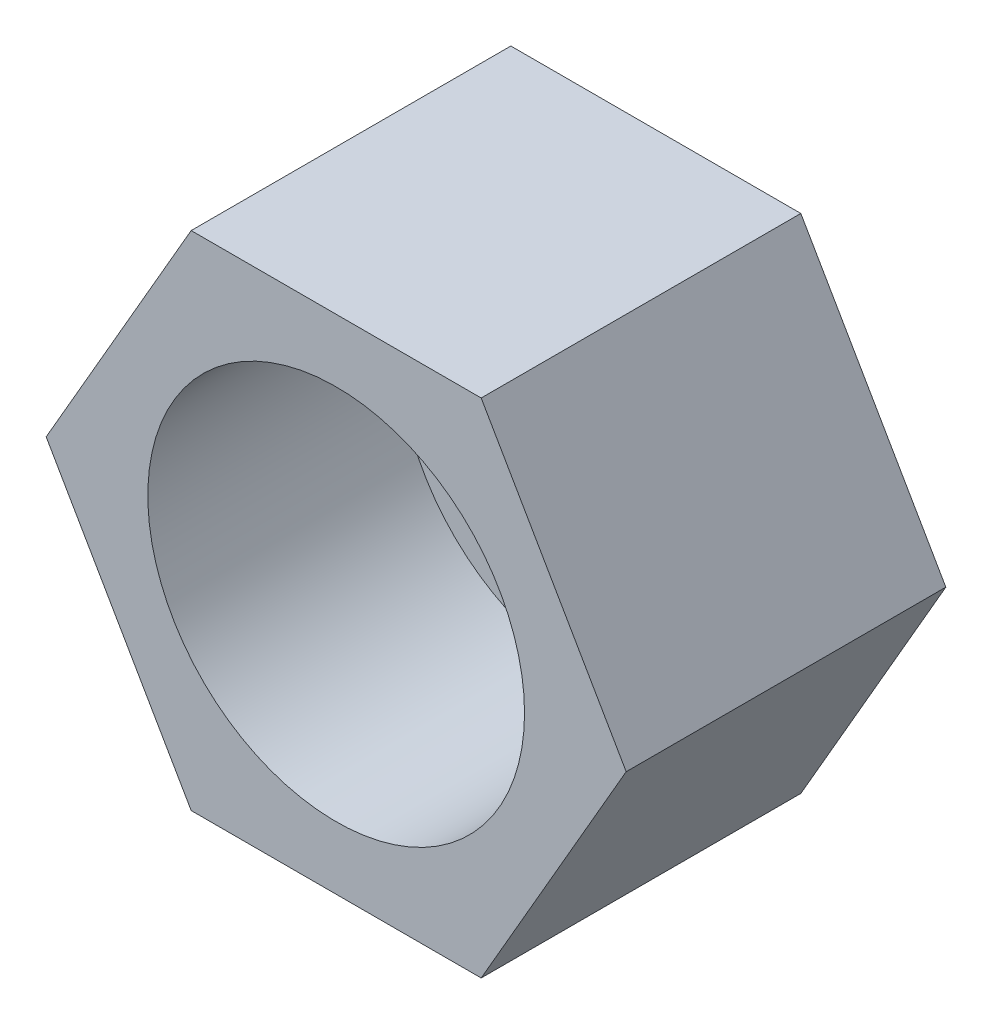
ISO-10303-21;
HEADER;
FILE_DESCRIPTION(('STEP AP214'),'2;1');
FILE_NAME('part.step','',(''),(''),'','','');
FILE_SCHEMA(('AUTOMOTIVE_DESIGN { 1 0 10303 214 1 1 1 1 }'));
ENDSEC;
DATA;
#1=APPLICATION_CONTEXT('core data for automotive mechanical design processes');
#2=APPLICATION_PROTOCOL_DEFINITION('international standard','automotive_design',2000,#1);
#3=PRODUCT_CONTEXT('',#1,'mechanical');
#4=PRODUCT('Part','Part','',(#3));
#5=PRODUCT_RELATED_PRODUCT_CATEGORY('part','',(#4));
#6=PRODUCT_DEFINITION_FORMATION('','',#4);
#7=PRODUCT_DEFINITION_CONTEXT('part definition',#1,'design');
#8=PRODUCT_DEFINITION('design','',#6,#7);
#9=PRODUCT_DEFINITION_SHAPE('','',#8);
#10=(LENGTH_UNIT() NAMED_UNIT(*) SI_UNIT(.MILLI.,.METRE.));
#11=(NAMED_UNIT(*) PLANE_ANGLE_UNIT() SI_UNIT($,.RADIAN.));
#12=(NAMED_UNIT(*) SI_UNIT($,.STERADIAN.) SOLID_ANGLE_UNIT());
#13=UNCERTAINTY_MEASURE_WITH_UNIT(LENGTH_MEASURE(1.E-05),#10,'distance_accuracy_value','');
#14=(GEOMETRIC_REPRESENTATION_CONTEXT(3) GLOBAL_UNCERTAINTY_ASSIGNED_CONTEXT((#13)) GLOBAL_UNIT_ASSIGNED_CONTEXT((#10,
#11,#12)) REPRESENTATION_CONTEXT('',''));
#15=CARTESIAN_POINT('',(0.,0.,0.));
#16=DIRECTION('',(0.,0.,1.));
#17=DIRECTION('',(1.,0.,0.));
#18=AXIS2_PLACEMENT_3D('',#15,#16,#17);
#19=CARTESIAN_POINT('',(0.,0.,0.));
#20=DIRECTION('',(0.,0.,1.));
#21=DIRECTION('',(1.,0.,0.));
#22=AXIS2_PLACEMENT_3D('',#19,#20,#21);
#23=CYLINDRICAL_SURFACE('',#22,6.9);
#24=CARTESIAN_POINT('',(0.,0.,0.));
#25=DIRECTION('',(0.,0.,1.));
#26=DIRECTION('',(1.,0.,0.));
#27=AXIS2_PLACEMENT_3D('',#24,#25,#26);
#28=CIRCLE('',#27,6.9);
#29=CARTESIAN_POINT('',(6.9,0.,0.));
#30=VERTEX_POINT('',#29);
#31=EDGE_CURVE('E126',#30,#30,#28,.T.);
#32=ORIENTED_EDGE('',*,*,#31,.F.);
#33=EDGE_LOOP('',(#32));
#34=FACE_BOUND('',#33,.T.);
#35=CARTESIAN_POINT('',(0.,0.,3.));
#36=DIRECTION('',(0.,0.,1.));
#37=DIRECTION('',(1.,0.,0.));
#38=AXIS2_PLACEMENT_3D('',#35,#36,#37);
#39=CIRCLE('',#38,6.9);
#40=CARTESIAN_POINT('',(6.9,0.,3.));
#41=VERTEX_POINT('',#40);
#42=EDGE_CURVE('E40',#41,#41,#39,.F.);
#43=ORIENTED_EDGE('',*,*,#42,.F.);
#44=EDGE_LOOP('',(#43));
#45=FACE_BOUND('',#44,.T.);
#46=ADVANCED_FACE('F36',(#34,#45),#23,.F.);
#47=CARTESIAN_POINT('',(-6.35085296108589,11.,14.));
#48=DIRECTION('',(0.866025403784438,-0.5,0.));
#49=DIRECTION('',(0.5,0.866025403784439,0.));
#50=AXIS2_PLACEMENT_3D('',#47,#48,#49);
#51=PLANE('',#50);
#52=DIRECTION('',(-0.5,-0.866025403784438,0.));
#53=VECTOR('',#52,1.);
#54=CARTESIAN_POINT('',(-6.35085296108589,11.,0.));
#55=LINE('',#54,#53);
#56=CARTESIAN_POINT('',(-6.35085296108589,11.,0.));
#57=VERTEX_POINT('',#56);
#58=CARTESIAN_POINT('',(-12.7017059221718,0.,0.));
#59=VERTEX_POINT('',#58);
#60=EDGE_CURVE('E122',#57,#59,#55,.T.);
#61=ORIENTED_EDGE('',*,*,#60,.T.);
#62=DIRECTION('',(0.,0.,-1.));
#63=VECTOR('',#62,1.);
#64=CARTESIAN_POINT('',(-12.7017059221718,0.,14.));
#65=LINE('',#64,#63);
#66=CARTESIAN_POINT('',(-12.7017059221718,0.,14.));
#67=VERTEX_POINT('',#66);
#68=EDGE_CURVE('E11',#67,#59,#65,.T.);
#69=ORIENTED_EDGE('',*,*,#68,.F.);
#70=DIRECTION('',(-0.5,-0.866025403784438,0.));
#71=VECTOR('',#70,1.);
#72=CARTESIAN_POINT('',(-6.35085296108589,11.,14.));
#73=LINE('',#72,#71);
#74=CARTESIAN_POINT('',(-6.35085296108589,11.,14.));
#75=VERTEX_POINT('',#74);
#76=EDGE_CURVE('E133',#75,#67,#73,.T.);
#77=ORIENTED_EDGE('',*,*,#76,.F.);
#78=DIRECTION('',(0.,0.,-1.));
#79=VECTOR('',#78,1.);
#80=CARTESIAN_POINT('',(-6.35085296108589,11.,14.));
#81=LINE('',#80,#79);
#82=EDGE_CURVE('E118',#75,#57,#81,.T.);
#83=ORIENTED_EDGE('',*,*,#82,.T.);
#84=EDGE_LOOP('',(#61,#69,#77,#83));
#85=FACE_BOUND('',#84,.T.);
#86=ADVANCED_FACE('F38',(#85),#51,.F.);
#87=CARTESIAN_POINT('',(-12.7017059221718,0.,14.));
#88=DIRECTION('',(0.866025403784439,0.5,0.));
#89=DIRECTION('',(-0.5,0.866025403784439,0.));
#90=AXIS2_PLACEMENT_3D('',#87,#88,#89);
#91=PLANE('',#90);
#92=DIRECTION('',(0.5,-0.866025403784439,0.));
#93=VECTOR('',#92,1.);
#94=CARTESIAN_POINT('',(-12.7017059221718,0.,0.));
#95=LINE('',#94,#93);
#96=CARTESIAN_POINT('',(-6.35085296108589,-11.,0.));
#97=VERTEX_POINT('',#96);
#98=EDGE_CURVE('E125',#59,#97,#95,.T.);
#99=ORIENTED_EDGE('',*,*,#98,.T.);
#100=DIRECTION('',(0.,0.,-1.));
#101=VECTOR('',#100,1.);
#102=CARTESIAN_POINT('',(-6.35085296108589,-11.,14.));
#103=LINE('',#102,#101);
#104=CARTESIAN_POINT('',(-6.35085296108589,-11.,14.));
#105=VERTEX_POINT('',#104);
#106=EDGE_CURVE('E46',#105,#97,#103,.T.);
#107=ORIENTED_EDGE('',*,*,#106,.F.);
#108=DIRECTION('',(0.5,-0.866025403784439,0.));
#109=VECTOR('',#108,1.);
#110=CARTESIAN_POINT('',(-12.7017059221718,0.,14.));
#111=LINE('',#110,#109);
#112=EDGE_CURVE('E91',#67,#105,#111,.T.);
#113=ORIENTED_EDGE('',*,*,#112,.F.);
#114=ORIENTED_EDGE('',*,*,#68,.T.);
#115=EDGE_LOOP('',(#99,#107,#113,#114));
#116=FACE_BOUND('',#115,.T.);
#117=ADVANCED_FACE('F164',(#116),#91,.F.);
#118=CARTESIAN_POINT('',(-6.35085296108589,-11.,14.));
#119=DIRECTION('',(0.,1.,0.));
#120=DIRECTION('',(-1.,0.,0.));
#121=AXIS2_PLACEMENT_3D('',#118,#119,#120);
#122=PLANE('',#121);
#123=DIRECTION('',(1.,0.,0.));
#124=VECTOR('',#123,1.);
#125=CARTESIAN_POINT('',(-6.35085296108589,-11.,0.));
#126=LINE('',#125,#124);
#127=CARTESIAN_POINT('',(6.35085296108588,-11.,0.));
#128=VERTEX_POINT('',#127);
#129=EDGE_CURVE('E128',#97,#128,#126,.T.);
#130=ORIENTED_EDGE('',*,*,#129,.T.);
#131=DIRECTION('',(0.,0.,-1.));
#132=VECTOR('',#131,1.);
#133=CARTESIAN_POINT('',(6.35085296108588,-11.,14.));
#134=LINE('',#133,#132);
#135=CARTESIAN_POINT('',(6.35085296108588,-11.,14.));
#136=VERTEX_POINT('',#135);
#137=EDGE_CURVE('E113',#136,#128,#134,.T.);
#138=ORIENTED_EDGE('',*,*,#137,.F.);
#139=DIRECTION('',(1.,0.,0.));
#140=VECTOR('',#139,1.);
#141=CARTESIAN_POINT('',(-6.35085296108589,-11.,14.));
#142=LINE('',#141,#140);
#143=EDGE_CURVE('E104',#105,#136,#142,.T.);
#144=ORIENTED_EDGE('',*,*,#143,.F.);
#145=ORIENTED_EDGE('',*,*,#106,.T.);
#146=EDGE_LOOP('',(#130,#138,#144,#145));
#147=FACE_BOUND('',#146,.T.);
#148=ADVANCED_FACE('F140',(#147),#122,.F.);
#149=CARTESIAN_POINT('',(6.35085296108588,-11.,14.));
#150=DIRECTION('',(-0.866025403784439,0.5,0.));
#151=DIRECTION('',(-0.5,-0.866025403784439,0.));
#152=AXIS2_PLACEMENT_3D('',#149,#150,#151);
#153=PLANE('',#152);
#154=DIRECTION('',(0.5,0.866025403784439,0.));
#155=VECTOR('',#154,1.);
#156=CARTESIAN_POINT('',(6.35085296108588,-11.,0.));
#157=LINE('',#156,#155);
#158=CARTESIAN_POINT('',(12.7017059221718,0.,0.));
#159=VERTEX_POINT('',#158);
#160=EDGE_CURVE('E112',#128,#159,#157,.T.);
#161=ORIENTED_EDGE('',*,*,#160,.T.);
#162=DIRECTION('',(0.,0.,-1.));
#163=VECTOR('',#162,1.);
#164=CARTESIAN_POINT('',(12.7017059221718,0.,14.));
#165=LINE('',#164,#163);
#166=CARTESIAN_POINT('',(12.7017059221718,0.,14.));
#167=VERTEX_POINT('',#166);
#168=EDGE_CURVE('E109',#167,#159,#165,.T.);
#169=ORIENTED_EDGE('',*,*,#168,.F.);
#170=DIRECTION('',(0.5,0.866025403784439,0.));
#171=VECTOR('',#170,1.);
#172=CARTESIAN_POINT('',(6.35085296108588,-11.,14.));
#173=LINE('',#172,#171);
#174=EDGE_CURVE('E98',#136,#167,#173,.T.);
#175=ORIENTED_EDGE('',*,*,#174,.F.);
#176=ORIENTED_EDGE('',*,*,#137,.T.);
#177=EDGE_LOOP('',(#161,#169,#175,#176));
#178=FACE_BOUND('',#177,.T.);
#179=ADVANCED_FACE('F110',(#178),#153,.F.);
#180=CARTESIAN_POINT('',(12.7017059221718,0.,14.));
#181=DIRECTION('',(-0.866025403784438,-0.5,0.));
#182=DIRECTION('',(0.5,-0.866025403784439,0.));
#183=AXIS2_PLACEMENT_3D('',#180,#181,#182);
#184=PLANE('',#183);
#185=DIRECTION('',(-0.5,0.866025403784438,0.));
#186=VECTOR('',#185,1.);
#187=CARTESIAN_POINT('',(12.7017059221718,0.,0.));
#188=LINE('',#187,#186);
#189=CARTESIAN_POINT('',(6.35085296108587,11.,0.));
#190=VERTEX_POINT('',#189);
#191=EDGE_CURVE('E77',#159,#190,#188,.T.);
#192=ORIENTED_EDGE('',*,*,#191,.T.);
#193=DIRECTION('',(0.,0.,-1.));
#194=VECTOR('',#193,1.);
#195=CARTESIAN_POINT('',(6.35085296108587,11.,14.));
#196=LINE('',#195,#194);
#197=CARTESIAN_POINT('',(6.35085296108587,11.,14.));
#198=VERTEX_POINT('',#197);
#199=EDGE_CURVE('E114',#198,#190,#196,.T.);
#200=ORIENTED_EDGE('',*,*,#199,.F.);
#201=DIRECTION('',(-0.5,0.866025403784438,0.));
#202=VECTOR('',#201,1.);
#203=CARTESIAN_POINT('',(12.7017059221718,0.,14.));
#204=LINE('',#203,#202);
#205=EDGE_CURVE('E102',#167,#198,#204,.T.);
#206=ORIENTED_EDGE('',*,*,#205,.F.);
#207=ORIENTED_EDGE('',*,*,#168,.T.);
#208=EDGE_LOOP('',(#192,#200,#206,#207));
#209=FACE_BOUND('',#208,.T.);
#210=ADVANCED_FACE('F116',(#209),#184,.F.);
#211=CARTESIAN_POINT('',(6.35085296108587,11.,14.));
#212=DIRECTION('',(0.,-1.,0.));
#213=DIRECTION('',(1.,0.,0.));
#214=AXIS2_PLACEMENT_3D('',#211,#212,#213);
#215=PLANE('',#214);
#216=DIRECTION('',(-1.,0.,0.));
#217=VECTOR('',#216,1.);
#218=CARTESIAN_POINT('',(6.35085296108587,11.,0.));
#219=LINE('',#218,#217);
#220=EDGE_CURVE('E83',#190,#57,#219,.T.);
#221=ORIENTED_EDGE('',*,*,#220,.T.);
#222=ORIENTED_EDGE('',*,*,#82,.F.);
#223=DIRECTION('',(-1.,0.,0.));
#224=VECTOR('',#223,1.);
#225=CARTESIAN_POINT('',(6.35085296108587,11.,14.));
#226=LINE('',#225,#224);
#227=EDGE_CURVE('E54',#198,#75,#226,.T.);
#228=ORIENTED_EDGE('',*,*,#227,.F.);
#229=ORIENTED_EDGE('',*,*,#199,.T.);
#230=EDGE_LOOP('',(#221,#222,#228,#229));
#231=FACE_BOUND('',#230,.T.);
#232=ADVANCED_FACE('F147',(#231),#215,.F.);
#233=CARTESIAN_POINT('',(0.,22.,14.));
#234=DIRECTION('',(0.,0.,-1.));
#235=DIRECTION('',(-1.,0.,0.));
#236=AXIS2_PLACEMENT_3D('',#233,#234,#235);
#237=PLANE('',#236);
#238=CARTESIAN_POINT('',(0.,0.,14.));
#239=DIRECTION('',(0.,0.,1.));
#240=DIRECTION('',(1.,0.,0.));
#241=AXIS2_PLACEMENT_3D('',#238,#239,#240);
#242=CIRCLE('',#241,8.25);
#243=CARTESIAN_POINT('',(8.25,0.,14.));
#244=VERTEX_POINT('',#243);
#245=EDGE_CURVE('E183',#244,#244,#242,.T.);
#246=ORIENTED_EDGE('',*,*,#245,.F.);
#247=EDGE_LOOP('',(#246));
#248=FACE_BOUND('',#247,.T.);
#249=ORIENTED_EDGE('',*,*,#76,.T.);
#250=ORIENTED_EDGE('',*,*,#112,.T.);
#251=ORIENTED_EDGE('',*,*,#143,.T.);
#252=ORIENTED_EDGE('',*,*,#174,.T.);
#253=ORIENTED_EDGE('',*,*,#205,.T.);
#254=ORIENTED_EDGE('',*,*,#227,.T.);
#255=EDGE_LOOP('',(#249,#250,#251,#252,#253,#254));
#256=FACE_BOUND('',#255,.T.);
#257=ADVANCED_FACE('F100',(#248,#256),#237,.F.);
#258=CARTESIAN_POINT('',(0.,22.,0.));
#259=DIRECTION('',(0.,0.,-1.));
#260=DIRECTION('',(-1.,0.,0.));
#261=AXIS2_PLACEMENT_3D('',#258,#259,#260);
#262=PLANE('',#261);
#263=ORIENTED_EDGE('',*,*,#31,.T.);
#264=EDGE_LOOP('',(#263));
#265=FACE_BOUND('',#264,.T.);
#266=ORIENTED_EDGE('',*,*,#60,.F.);
#267=ORIENTED_EDGE('',*,*,#220,.F.);
#268=ORIENTED_EDGE('',*,*,#191,.F.);
#269=ORIENTED_EDGE('',*,*,#160,.F.);
#270=ORIENTED_EDGE('',*,*,#129,.F.);
#271=ORIENTED_EDGE('',*,*,#98,.F.);
#272=EDGE_LOOP('',(#266,#267,#268,#269,#270,#271));
#273=FACE_BOUND('',#272,.T.);
#274=ADVANCED_FACE('F143',(#265,#273),#262,.T.);
#275=CARTESIAN_POINT('',(0.,0.,3.));
#276=DIRECTION('',(0.,0.,1.));
#277=DIRECTION('',(1.,0.,0.));
#278=AXIS2_PLACEMENT_3D('',#275,#276,#277);
#279=PLANE('',#278);
#280=CARTESIAN_POINT('',(0.,0.,3.));
#281=DIRECTION('',(0.,0.,1.));
#282=DIRECTION('',(1.,0.,0.));
#283=AXIS2_PLACEMENT_3D('',#280,#281,#282);
#284=CIRCLE('',#283,8.25);
#285=CARTESIAN_POINT('',(8.25,0.,3.));
#286=VERTEX_POINT('',#285);
#287=EDGE_CURVE('E180',#286,#286,#284,.T.);
#288=ORIENTED_EDGE('',*,*,#287,.T.);
#289=EDGE_LOOP('',(#288));
#290=FACE_BOUND('',#289,.T.);
#291=ORIENTED_EDGE('',*,*,#42,.T.);
#292=EDGE_LOOP('',(#291));
#293=FACE_BOUND('',#292,.T.);
#294=ADVANCED_FACE('F171',(#290,#293),#279,.T.);
#295=CARTESIAN_POINT('',(0.,0.,3.));
#296=DIRECTION('',(0.,0.,1.));
#297=DIRECTION('',(1.,0.,0.));
#298=AXIS2_PLACEMENT_3D('',#295,#296,#297);
#299=CYLINDRICAL_SURFACE('',#298,8.25);
#300=ORIENTED_EDGE('',*,*,#287,.F.);
#301=EDGE_LOOP('',(#300));
#302=FACE_BOUND('',#301,.T.);
#303=ORIENTED_EDGE('',*,*,#245,.T.);
#304=EDGE_LOOP('',(#303));
#305=FACE_BOUND('',#304,.T.);
#306=ADVANCED_FACE('F168',(#302,#305),#299,.F.);
#307=CLOSED_SHELL('',(#46,#86,#117,#148,#179,#210,#232,#257,#274,#294,#306));
#308=MANIFOLD_SOLID_BREP('B2',#307);
#309=ADVANCED_BREP_SHAPE_REPRESENTATION('',(#18,#308),#14);
#310=SHAPE_DEFINITION_REPRESENTATION(#9,#309);
ENDSEC;
END-ISO-10303-21;
